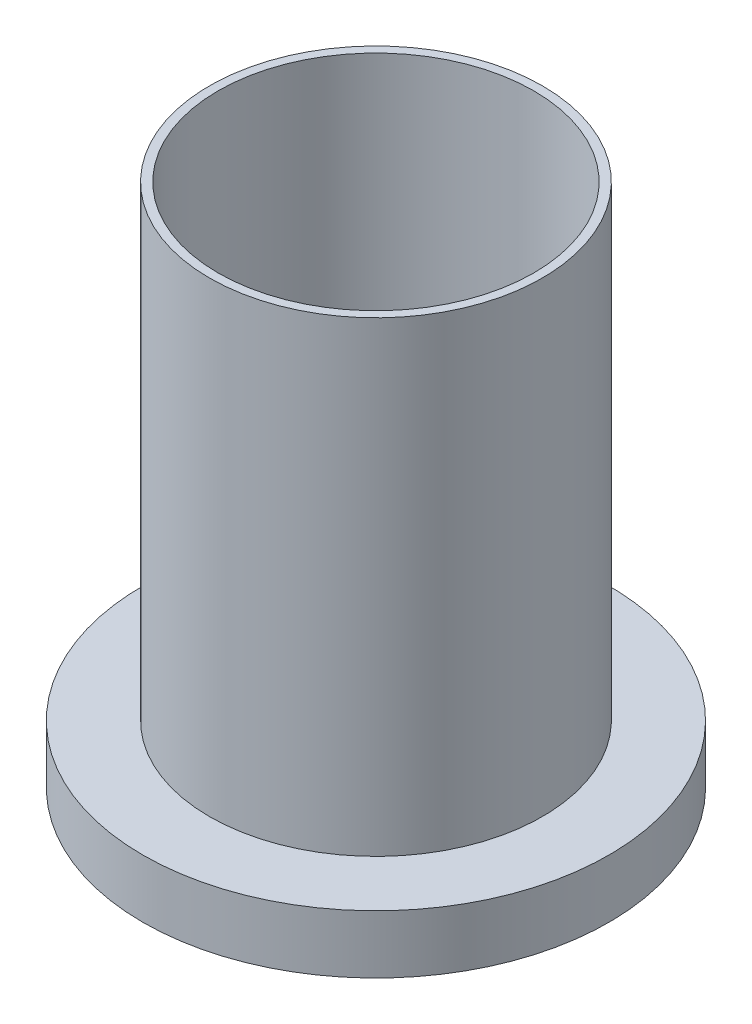
ISO-10303-21;
HEADER;
FILE_DESCRIPTION(('STEP AP214'),'2;1');
FILE_NAME('part.step','',(''),(''),'','','');
FILE_SCHEMA(('AUTOMOTIVE_DESIGN { 1 0 10303 214 1 1 1 1 }'));
ENDSEC;
DATA;
#1=APPLICATION_CONTEXT('core data for automotive mechanical design processes');
#2=APPLICATION_PROTOCOL_DEFINITION('international standard','automotive_design',2000,#1);
#3=PRODUCT_CONTEXT('',#1,'mechanical');
#4=PRODUCT('Part','Part','',(#3));
#5=PRODUCT_RELATED_PRODUCT_CATEGORY('part','',(#4));
#6=PRODUCT_DEFINITION_FORMATION('','',#4);
#7=PRODUCT_DEFINITION_CONTEXT('part definition',#1,'design');
#8=PRODUCT_DEFINITION('design','',#6,#7);
#9=PRODUCT_DEFINITION_SHAPE('','',#8);
#10=(LENGTH_UNIT() NAMED_UNIT(*) SI_UNIT(.MILLI.,.METRE.));
#11=(NAMED_UNIT(*) PLANE_ANGLE_UNIT() SI_UNIT($,.RADIAN.));
#12=(NAMED_UNIT(*) SI_UNIT($,.STERADIAN.) SOLID_ANGLE_UNIT());
#13=UNCERTAINTY_MEASURE_WITH_UNIT(LENGTH_MEASURE(1.E-05),#10,'distance_accuracy_value','');
#14=(GEOMETRIC_REPRESENTATION_CONTEXT(3) GLOBAL_UNCERTAINTY_ASSIGNED_CONTEXT((#13)) GLOBAL_UNIT_ASSIGNED_CONTEXT((#10,
#11,#12)) REPRESENTATION_CONTEXT('',''));
#15=CARTESIAN_POINT('',(0.,0.,0.));
#16=DIRECTION('',(0.,0.,1.));
#17=DIRECTION('',(1.,0.,0.));
#18=AXIS2_PLACEMENT_3D('',#15,#16,#17);
#19=CARTESIAN_POINT('',(0.,100.076,0.));
#20=DIRECTION('',(0.,-1.,0.));
#21=DIRECTION('',(0.,0.,-1.));
#22=AXIS2_PLACEMENT_3D('',#19,#20,#21);
#23=CYLINDRICAL_SURFACE('',#22,30.099);
#24=CARTESIAN_POINT('',(0.,100.076,0.));
#25=DIRECTION('',(0.,1.,0.));
#26=DIRECTION('',(0.,0.,1.));
#27=AXIS2_PLACEMENT_3D('',#24,#25,#26);
#28=CIRCLE('',#27,30.099);
#29=CARTESIAN_POINT('',(0.,100.076,30.099));
#30=VERTEX_POINT('',#29);
#31=EDGE_CURVE('E40',#30,#30,#28,.T.);
#32=ORIENTED_EDGE('',*,*,#31,.T.);
#33=EDGE_LOOP('',(#32));
#34=FACE_BOUND('',#33,.T.);
#35=CARTESIAN_POINT('',(0.,0.,0.));
#36=DIRECTION('',(0.,1.,0.));
#37=DIRECTION('',(0.,0.,1.));
#38=AXIS2_PLACEMENT_3D('',#35,#36,#37);
#39=CIRCLE('',#38,30.099);
#40=CARTESIAN_POINT('',(0.,0.,30.099));
#41=VERTEX_POINT('',#40);
#42=EDGE_CURVE('E36',#41,#41,#39,.T.);
#43=ORIENTED_EDGE('',*,*,#42,.F.);
#44=EDGE_LOOP('',(#43));
#45=FACE_BOUND('',#44,.T.);
#46=ADVANCED_FACE('F33',(#34,#45),#23,.F.);
#47=CARTESIAN_POINT('',(0.,100.076,0.));
#48=DIRECTION('',(0.,-1.,0.));
#49=DIRECTION('',(0.,0.,-1.));
#50=AXIS2_PLACEMENT_3D('',#47,#48,#49);
#51=CYLINDRICAL_SURFACE('',#50,31.75);
#52=CARTESIAN_POINT('',(0.,11.1125,0.));
#53=DIRECTION('',(0.,1.,0.));
#54=DIRECTION('',(0.,0.,1.));
#55=AXIS2_PLACEMENT_3D('',#52,#53,#54);
#56=CIRCLE('',#55,31.75);
#57=CARTESIAN_POINT('',(0.,11.1125,31.75));
#58=VERTEX_POINT('',#57);
#59=EDGE_CURVE('E49',#58,#58,#56,.T.);
#60=ORIENTED_EDGE('',*,*,#59,.T.);
#61=EDGE_LOOP('',(#60));
#62=FACE_BOUND('',#61,.T.);
#63=CARTESIAN_POINT('',(0.,100.076,0.));
#64=DIRECTION('',(0.,1.,0.));
#65=DIRECTION('',(0.,0.,1.));
#66=AXIS2_PLACEMENT_3D('',#63,#64,#65);
#67=CIRCLE('',#66,31.75);
#68=CARTESIAN_POINT('',(0.,100.076,31.75));
#69=VERTEX_POINT('',#68);
#70=EDGE_CURVE('E10',#69,#69,#67,.T.);
#71=ORIENTED_EDGE('',*,*,#70,.F.);
#72=EDGE_LOOP('',(#71));
#73=FACE_BOUND('',#72,.T.);
#74=ADVANCED_FACE('F56',(#62,#73),#51,.T.);
#75=CARTESIAN_POINT('',(0.,100.076,0.));
#76=DIRECTION('',(0.,1.,0.));
#77=DIRECTION('',(0.,0.,1.));
#78=AXIS2_PLACEMENT_3D('',#75,#76,#77);
#79=PLANE('',#78);
#80=ORIENTED_EDGE('',*,*,#31,.F.);
#81=EDGE_LOOP('',(#80));
#82=FACE_BOUND('',#81,.T.);
#83=ORIENTED_EDGE('',*,*,#70,.T.);
#84=EDGE_LOOP('',(#83));
#85=FACE_BOUND('',#84,.T.);
#86=ADVANCED_FACE('F73',(#82,#85),#79,.T.);
#87=CARTESIAN_POINT('',(0.,0.,0.));
#88=DIRECTION('',(0.,1.,0.));
#89=DIRECTION('',(0.,0.,1.));
#90=AXIS2_PLACEMENT_3D('',#87,#88,#89);
#91=PLANE('',#90);
#92=ORIENTED_EDGE('',*,*,#42,.T.);
#93=EDGE_LOOP('',(#92));
#94=FACE_BOUND('',#93,.T.);
#95=CARTESIAN_POINT('',(0.,0.,0.));
#96=DIRECTION('',(0.,1.,0.));
#97=DIRECTION('',(0.,0.,1.));
#98=AXIS2_PLACEMENT_3D('',#95,#96,#97);
#99=CIRCLE('',#98,44.45);
#100=CARTESIAN_POINT('',(0.,0.,44.45));
#101=VERTEX_POINT('',#100);
#102=EDGE_CURVE('E46',#101,#101,#99,.T.);
#103=ORIENTED_EDGE('',*,*,#102,.F.);
#104=EDGE_LOOP('',(#103));
#105=FACE_BOUND('',#104,.T.);
#106=ADVANCED_FACE('F68',(#94,#105),#91,.F.);
#107=CARTESIAN_POINT('',(0.,11.1125,0.));
#108=DIRECTION('',(0.,-1.,0.));
#109=DIRECTION('',(0.,0.,-1.));
#110=AXIS2_PLACEMENT_3D('',#107,#108,#109);
#111=CYLINDRICAL_SURFACE('',#110,44.45);
#112=CARTESIAN_POINT('',(0.,11.1125,0.));
#113=DIRECTION('',(0.,1.,0.));
#114=DIRECTION('',(0.,0.,1.));
#115=AXIS2_PLACEMENT_3D('',#112,#113,#114);
#116=CIRCLE('',#115,44.45);
#117=CARTESIAN_POINT('',(0.,11.1125,44.45));
#118=VERTEX_POINT('',#117);
#119=EDGE_CURVE('E50',#118,#118,#116,.T.);
#120=ORIENTED_EDGE('',*,*,#119,.F.);
#121=EDGE_LOOP('',(#120));
#122=FACE_BOUND('',#121,.T.);
#123=ORIENTED_EDGE('',*,*,#102,.T.);
#124=EDGE_LOOP('',(#123));
#125=FACE_BOUND('',#124,.T.);
#126=ADVANCED_FACE('F62',(#122,#125),#111,.T.);
#127=CARTESIAN_POINT('',(0.,11.1125,0.));
#128=DIRECTION('',(0.,1.,0.));
#129=DIRECTION('',(0.,0.,1.));
#130=AXIS2_PLACEMENT_3D('',#127,#128,#129);
#131=PLANE('',#130);
#132=ORIENTED_EDGE('',*,*,#59,.F.);
#133=EDGE_LOOP('',(#132));
#134=FACE_BOUND('',#133,.T.);
#135=ORIENTED_EDGE('',*,*,#119,.T.);
#136=EDGE_LOOP('',(#135));
#137=FACE_BOUND('',#136,.T.);
#138=ADVANCED_FACE('F59',(#134,#137),#131,.T.);
#139=CLOSED_SHELL('',(#46,#74,#86,#106,#126,#138));
#140=MANIFOLD_SOLID_BREP('B2',#139);
#141=ADVANCED_BREP_SHAPE_REPRESENTATION('',(#18,#140),#14);
#142=SHAPE_DEFINITION_REPRESENTATION(#9,#141);
ENDSEC;
END-ISO-10303-21;
